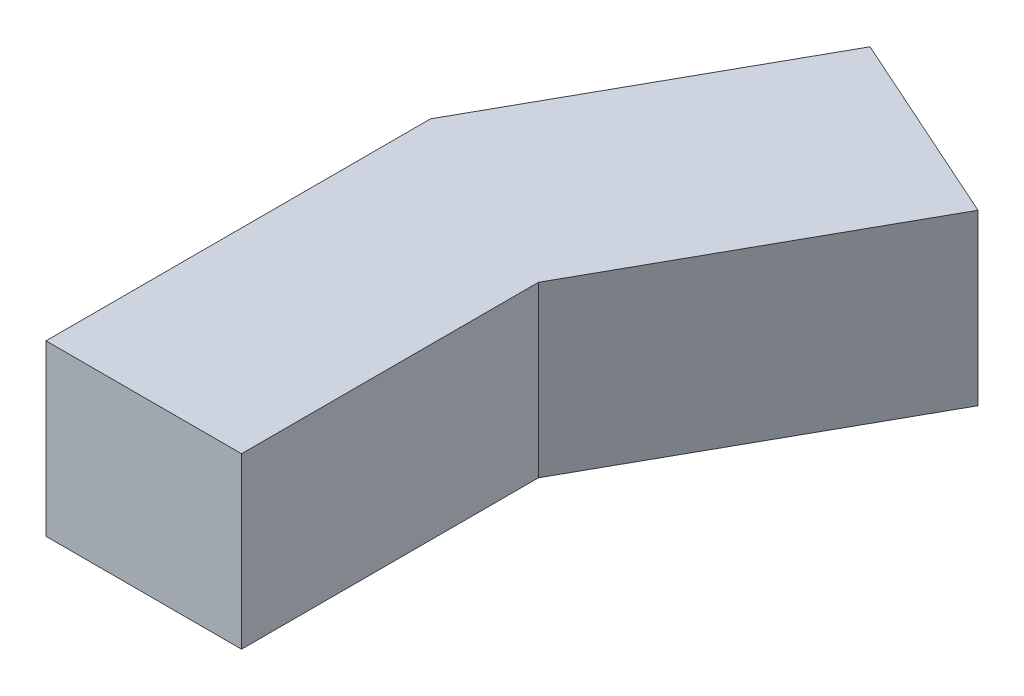
ISO-10303-21;
HEADER;
FILE_DESCRIPTION(('STEP AP214'),'2;1');
FILE_NAME('part.step','',(''),(''),'','','');
FILE_SCHEMA(('AUTOMOTIVE_DESIGN { 1 0 10303 214 1 1 1 1 }'));
ENDSEC;
DATA;
#1=APPLICATION_CONTEXT('core data for automotive mechanical design processes');
#2=APPLICATION_PROTOCOL_DEFINITION('international standard','automotive_design',2000,#1);
#3=PRODUCT_CONTEXT('',#1,'mechanical');
#4=PRODUCT('Part','Part','',(#3));
#5=PRODUCT_RELATED_PRODUCT_CATEGORY('part','',(#4));
#6=PRODUCT_DEFINITION_FORMATION('','',#4);
#7=PRODUCT_DEFINITION_CONTEXT('part definition',#1,'design');
#8=PRODUCT_DEFINITION('design','',#6,#7);
#9=PRODUCT_DEFINITION_SHAPE('','',#8);
#10=(LENGTH_UNIT() NAMED_UNIT(*) SI_UNIT(.MILLI.,.METRE.));
#11=(NAMED_UNIT(*) PLANE_ANGLE_UNIT() SI_UNIT($,.RADIAN.));
#12=(NAMED_UNIT(*) SI_UNIT($,.STERADIAN.) SOLID_ANGLE_UNIT());
#13=UNCERTAINTY_MEASURE_WITH_UNIT(LENGTH_MEASURE(1.E-05),#10,'distance_accuracy_value','');
#14=(GEOMETRIC_REPRESENTATION_CONTEXT(3) GLOBAL_UNCERTAINTY_ASSIGNED_CONTEXT((#13)) GLOBAL_UNIT_ASSIGNED_CONTEXT((#10,
#11,#12)) REPRESENTATION_CONTEXT('',''));
#15=CARTESIAN_POINT('',(0.,0.,0.));
#16=DIRECTION('',(0.,0.,1.));
#17=DIRECTION('',(1.,0.,0.));
#18=AXIS2_PLACEMENT_3D('',#15,#16,#17);
#19=CARTESIAN_POINT('',(-11.,19.05,0.));
#20=DIRECTION('',(-1.,0.,0.));
#21=DIRECTION('',(0.,0.,1.));
#22=AXIS2_PLACEMENT_3D('',#19,#20,#21);
#23=PLANE('',#22);
#24=DIRECTION('',(0.,0.,-1.));
#25=VECTOR('',#24,1.);
#26=CARTESIAN_POINT('',(-11.,0.,0.));
#27=LINE('',#26,#25);
#28=CARTESIAN_POINT('',(-11.,0.,11.0170643207002));
#29=VERTEX_POINT('',#28);
#30=CARTESIAN_POINT('',(-11.,0.,-32.2459666858922));
#31=VERTEX_POINT('',#30);
#32=EDGE_CURVE('E128',#29,#31,#27,.T.);
#33=ORIENTED_EDGE('',*,*,#32,.F.);
#34=DIRECTION('',(0.,-1.,0.));
#35=VECTOR('',#34,1.);
#36=CARTESIAN_POINT('',(-11.,19.05,11.0170643207002));
#37=LINE('',#36,#35);
#38=CARTESIAN_POINT('',(-11.,19.05,11.0170643207002));
#39=VERTEX_POINT('',#38);
#40=EDGE_CURVE('E11',#39,#29,#37,.T.);
#41=ORIENTED_EDGE('',*,*,#40,.F.);
#42=DIRECTION('',(0.,0.,-1.));
#43=VECTOR('',#42,1.);
#44=CARTESIAN_POINT('',(-11.,19.05,0.));
#45=LINE('',#44,#43);
#46=CARTESIAN_POINT('',(-11.,19.05,-32.2459666858922));
#47=VERTEX_POINT('',#46);
#48=EDGE_CURVE('E147',#39,#47,#45,.T.);
#49=ORIENTED_EDGE('',*,*,#48,.T.);
#50=DIRECTION('',(0.,-1.,0.));
#51=VECTOR('',#50,1.);
#52=CARTESIAN_POINT('',(-11.,19.05,-32.2459666858922));
#53=LINE('',#52,#51);
#54=EDGE_CURVE('E58',#47,#31,#53,.T.);
#55=ORIENTED_EDGE('',*,*,#54,.T.);
#56=EDGE_LOOP('',(#33,#41,#49,#55));
#57=FACE_BOUND('',#56,.T.);
#58=ADVANCED_FACE('F41',(#57),#23,.T.);
#59=CARTESIAN_POINT('',(0.,19.05,11.0170643207002));
#60=DIRECTION('',(0.,0.,1.));
#61=DIRECTION('',(1.,0.,0.));
#62=AXIS2_PLACEMENT_3D('',#59,#60,#61);
#63=PLANE('',#62);
#64=DIRECTION('',(-1.,0.,0.));
#65=VECTOR('',#64,1.);
#66=CARTESIAN_POINT('',(0.,0.,11.0170643207002));
#67=LINE('',#66,#65);
#68=CARTESIAN_POINT('',(11.,0.,11.0170643207002));
#69=VERTEX_POINT('',#68);
#70=EDGE_CURVE('E131',#69,#29,#67,.T.);
#71=ORIENTED_EDGE('',*,*,#70,.F.);
#72=DIRECTION('',(0.,-1.,0.));
#73=VECTOR('',#72,1.);
#74=CARTESIAN_POINT('',(11.,19.05,11.0170643207002));
#75=LINE('',#74,#73);
#76=CARTESIAN_POINT('',(11.,19.05,11.0170643207002));
#77=VERTEX_POINT('',#76);
#78=EDGE_CURVE('E50',#77,#69,#75,.T.);
#79=ORIENTED_EDGE('',*,*,#78,.F.);
#80=DIRECTION('',(-1.,0.,0.));
#81=VECTOR('',#80,1.);
#82=CARTESIAN_POINT('',(0.,19.05,11.0170643207002));
#83=LINE('',#82,#81);
#84=EDGE_CURVE('E163',#77,#39,#83,.T.);
#85=ORIENTED_EDGE('',*,*,#84,.T.);
#86=ORIENTED_EDGE('',*,*,#40,.T.);
#87=EDGE_LOOP('',(#71,#79,#85,#86));
#88=FACE_BOUND('',#87,.T.);
#89=ADVANCED_FACE('F162',(#88),#63,.T.);
#90=CARTESIAN_POINT('',(11.,19.05,0.));
#91=DIRECTION('',(-1.,0.,0.));
#92=DIRECTION('',(0.,0.,1.));
#93=AXIS2_PLACEMENT_3D('',#90,#91,#92);
#94=PLANE('',#93);
#95=DIRECTION('',(0.,0.,-1.));
#96=VECTOR('',#95,1.);
#97=CARTESIAN_POINT('',(11.,0.,0.));
#98=LINE('',#97,#96);
#99=CARTESIAN_POINT('',(11.,0.,-22.3872673208331));
#100=VERTEX_POINT('',#99);
#101=EDGE_CURVE('E135',#69,#100,#98,.T.);
#102=ORIENTED_EDGE('',*,*,#101,.T.);
#103=DIRECTION('',(0.,-1.,0.));
#104=VECTOR('',#103,1.);
#105=CARTESIAN_POINT('',(11.,19.05,-22.3872673208331));
#106=LINE('',#105,#104);
#107=CARTESIAN_POINT('',(11.,19.05,-22.3872673208331));
#108=VERTEX_POINT('',#107);
#109=EDGE_CURVE('E118',#108,#100,#106,.T.);
#110=ORIENTED_EDGE('',*,*,#109,.F.);
#111=DIRECTION('',(0.,0.,-1.));
#112=VECTOR('',#111,1.);
#113=CARTESIAN_POINT('',(11.,19.05,0.));
#114=LINE('',#113,#112);
#115=EDGE_CURVE('E104',#77,#108,#114,.T.);
#116=ORIENTED_EDGE('',*,*,#115,.F.);
#117=ORIENTED_EDGE('',*,*,#78,.T.);
#118=EDGE_LOOP('',(#102,#110,#116,#117));
#119=FACE_BOUND('',#118,.T.);
#120=ADVANCED_FACE('F156',(#119),#94,.F.);
#121=CARTESIAN_POINT('',(-1.13277434651285,19.05,-0.631733310959954));
#122=DIRECTION('',(-0.873365917080469,0.,-0.487064651645129));
#123=DIRECTION('',(-0.487064651645129,0.,0.873365917080469));
#124=AXIS2_PLACEMENT_3D('',#121,#122,#123);
#125=PLANE('',#124);
#126=DIRECTION('',(0.487064651645129,0.,-0.87336591708047));
#127=VECTOR('',#126,1.);
#128=CARTESIAN_POINT('',(-1.13277434651285,0.,-0.631733310959954));
#129=LINE('',#128,#127);
#130=CARTESIAN_POINT('',(28.7065561951715,0.,-54.1372673208331));
#131=VERTEX_POINT('',#130);
#132=EDGE_CURVE('E114',#100,#131,#129,.T.);
#133=ORIENTED_EDGE('',*,*,#132,.T.);
#134=DIRECTION('',(0.,-1.,0.));
#135=VECTOR('',#134,1.);
#136=CARTESIAN_POINT('',(28.7065561951715,19.05,-54.1372673208331));
#137=LINE('',#136,#135);
#138=CARTESIAN_POINT('',(28.7065561951715,19.05,-54.1372673208331));
#139=VERTEX_POINT('',#138);
#140=EDGE_CURVE('E111',#139,#131,#137,.T.);
#141=ORIENTED_EDGE('',*,*,#140,.F.);
#142=DIRECTION('',(0.487064651645129,0.,-0.87336591708047));
#143=VECTOR('',#142,1.);
#144=CARTESIAN_POINT('',(-1.13277434651285,19.05,-0.631733310959954));
#145=LINE('',#144,#143);
#146=EDGE_CURVE('E96',#108,#139,#145,.T.);
#147=ORIENTED_EDGE('',*,*,#146,.F.);
#148=ORIENTED_EDGE('',*,*,#109,.T.);
#149=EDGE_LOOP('',(#133,#141,#147,#148));
#150=FACE_BOUND('',#149,.T.);
#151=ADVANCED_FACE('F112',(#150),#125,.F.);
#152=CARTESIAN_POINT('',(25.0037195748658,19.05,-55.7965924589024));
#153=DIRECTION('',(0.408939516978183,0.,-0.912561489135746));
#154=DIRECTION('',(-0.912561489135746,0.,-0.408939516978183));
#155=AXIS2_PLACEMENT_3D('',#152,#153,#154);
#156=PLANE('',#155);
#157=DIRECTION('',(0.912561489135746,0.,0.408939516978183));
#158=VECTOR('',#157,1.);
#159=CARTESIAN_POINT('',(25.0037195748658,0.,-55.7965924589024));
#160=LINE('',#159,#158);
#161=CARTESIAN_POINT('',(6.70655619517152,0.,-63.9959666858922));
#162=VERTEX_POINT('',#161);
#163=EDGE_CURVE('E140',#162,#131,#160,.T.);
#164=ORIENTED_EDGE('',*,*,#163,.F.);
#165=DIRECTION('',(0.,-1.,0.));
#166=VECTOR('',#165,1.);
#167=CARTESIAN_POINT('',(6.70655619517152,19.05,-63.9959666858922));
#168=LINE('',#167,#166);
#169=CARTESIAN_POINT('',(6.70655619517152,19.05,-63.9959666858922));
#170=VERTEX_POINT('',#169);
#171=EDGE_CURVE('E77',#170,#162,#168,.T.);
#172=ORIENTED_EDGE('',*,*,#171,.F.);
#173=DIRECTION('',(0.912561489135746,0.,0.408939516978183));
#174=VECTOR('',#173,1.);
#175=CARTESIAN_POINT('',(25.0037195748658,19.05,-55.7965924589024));
#176=LINE('',#175,#174);
#177=EDGE_CURVE('E101',#170,#139,#176,.T.);
#178=ORIENTED_EDGE('',*,*,#177,.T.);
#179=ORIENTED_EDGE('',*,*,#140,.T.);
#180=EDGE_LOOP('',(#164,#172,#178,#179));
#181=FACE_BOUND('',#180,.T.);
#182=ADVANCED_FACE('F120',(#181),#156,.T.);
#183=CARTESIAN_POINT('',(-22.1074202959966,19.05,-12.3290166866563));
#184=DIRECTION('',(-0.87336591708047,0.,-0.487064651645129));
#185=DIRECTION('',(-0.487064651645129,0.,0.873365917080469));
#186=AXIS2_PLACEMENT_3D('',#183,#184,#185);
#187=PLANE('',#186);
#188=DIRECTION('',(0.487064651645129,0.,-0.873365917080469));
#189=VECTOR('',#188,1.);
#190=CARTESIAN_POINT('',(-22.1074202959966,0.,-12.3290166866563));
#191=LINE('',#190,#189);
#192=EDGE_CURVE('E143',#31,#162,#191,.T.);
#193=ORIENTED_EDGE('',*,*,#192,.F.);
#194=ORIENTED_EDGE('',*,*,#54,.F.);
#195=DIRECTION('',(0.487064651645129,0.,-0.873365917080469));
#196=VECTOR('',#195,1.);
#197=CARTESIAN_POINT('',(-22.1074202959966,19.05,-12.3290166866563));
#198=LINE('',#197,#196);
#199=EDGE_CURVE('E122',#47,#170,#198,.T.);
#200=ORIENTED_EDGE('',*,*,#199,.T.);
#201=ORIENTED_EDGE('',*,*,#171,.T.);
#202=EDGE_LOOP('',(#193,#194,#200,#201));
#203=FACE_BOUND('',#202,.T.);
#204=ADVANCED_FACE('F164',(#203),#187,.T.);
#205=CARTESIAN_POINT('',(0.,19.05,0.));
#206=DIRECTION('',(0.,1.,0.));
#207=DIRECTION('',(0.,0.,1.));
#208=AXIS2_PLACEMENT_3D('',#205,#206,#207);
#209=PLANE('',#208);
#210=ORIENTED_EDGE('',*,*,#48,.F.);
#211=ORIENTED_EDGE('',*,*,#84,.F.);
#212=ORIENTED_EDGE('',*,*,#115,.T.);
#213=ORIENTED_EDGE('',*,*,#146,.T.);
#214=ORIENTED_EDGE('',*,*,#177,.F.);
#215=ORIENTED_EDGE('',*,*,#199,.F.);
#216=EDGE_LOOP('',(#210,#211,#212,#213,#214,#215));
#217=FACE_BOUND('',#216,.T.);
#218=ADVANCED_FACE('F98',(#217),#209,.T.);
#219=CARTESIAN_POINT('',(0.,0.,0.));
#220=DIRECTION('',(0.,1.,0.));
#221=DIRECTION('',(0.,0.,1.));
#222=AXIS2_PLACEMENT_3D('',#219,#220,#221);
#223=PLANE('',#222);
#224=ORIENTED_EDGE('',*,*,#32,.T.);
#225=ORIENTED_EDGE('',*,*,#192,.T.);
#226=ORIENTED_EDGE('',*,*,#163,.T.);
#227=ORIENTED_EDGE('',*,*,#132,.F.);
#228=ORIENTED_EDGE('',*,*,#101,.F.);
#229=ORIENTED_EDGE('',*,*,#70,.T.);
#230=EDGE_LOOP('',(#224,#225,#226,#227,#228,#229));
#231=FACE_BOUND('',#230,.T.);
#232=ADVANCED_FACE('F161',(#231),#223,.F.);
#233=CLOSED_SHELL('',(#58,#89,#120,#151,#182,#204,#218,#232));
#234=MANIFOLD_SOLID_BREP('B2',#233);
#235=ADVANCED_BREP_SHAPE_REPRESENTATION('',(#18,#234),#14);
#236=SHAPE_DEFINITION_REPRESENTATION(#9,#235);
ENDSEC;
END-ISO-10303-21;
